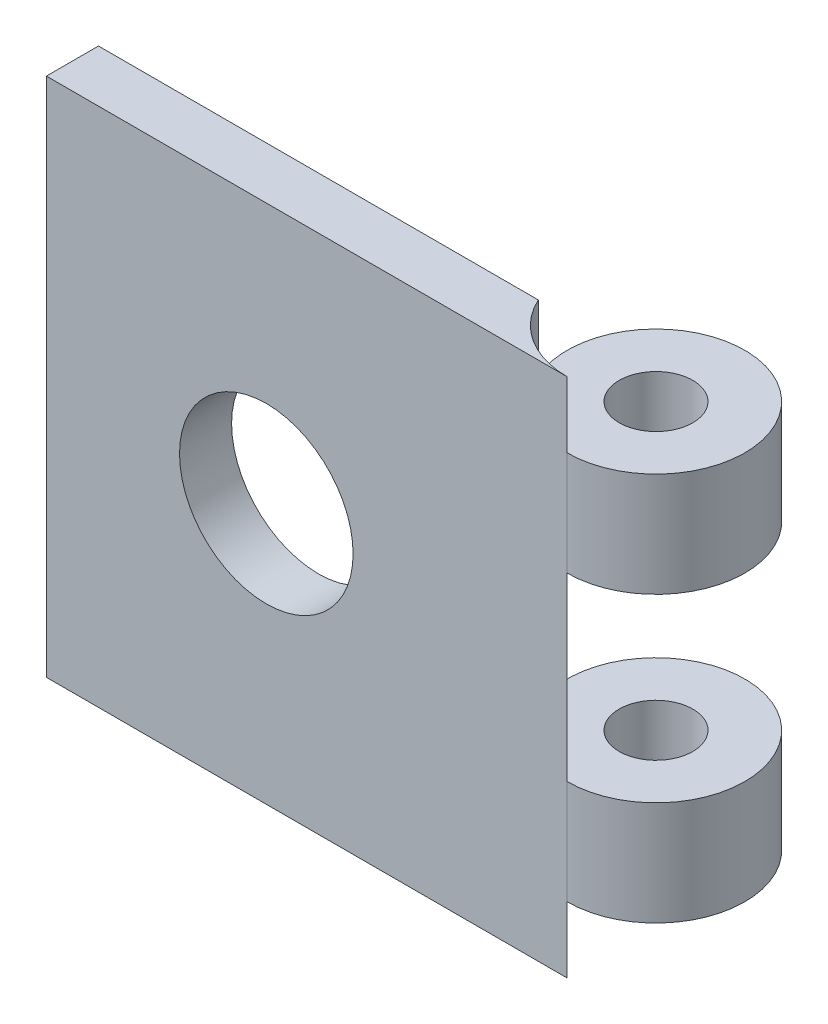
ISO-10303-21;
HEADER;
FILE_DESCRIPTION(('STEP AP214'),'2;1');
FILE_NAME('part.step','',(''),(''),'','','');
FILE_SCHEMA(('AUTOMOTIVE_DESIGN { 1 0 10303 214 1 1 1 1 }'));
ENDSEC;
DATA;
#1=APPLICATION_CONTEXT('core data for automotive mechanical design processes');
#2=APPLICATION_PROTOCOL_DEFINITION('international standard','automotive_design',2000,#1);
#3=PRODUCT_CONTEXT('',#1,'mechanical');
#4=PRODUCT('Part','Part','',(#3));
#5=PRODUCT_RELATED_PRODUCT_CATEGORY('part','',(#4));
#6=PRODUCT_DEFINITION_FORMATION('','',#4);
#7=PRODUCT_DEFINITION_CONTEXT('part definition',#1,'design');
#8=PRODUCT_DEFINITION('design','',#6,#7);
#9=PRODUCT_DEFINITION_SHAPE('','',#8);
#10=(LENGTH_UNIT() NAMED_UNIT(*) SI_UNIT(.MILLI.,.METRE.));
#11=(NAMED_UNIT(*) PLANE_ANGLE_UNIT() SI_UNIT($,.RADIAN.));
#12=(NAMED_UNIT(*) SI_UNIT($,.STERADIAN.) SOLID_ANGLE_UNIT());
#13=UNCERTAINTY_MEASURE_WITH_UNIT(LENGTH_MEASURE(1.E-05),#10,'distance_accuracy_value','');
#14=(GEOMETRIC_REPRESENTATION_CONTEXT(3) GLOBAL_UNCERTAINTY_ASSIGNED_CONTEXT((#13)) GLOBAL_UNIT_ASSIGNED_CONTEXT((#10,
#11,#12)) REPRESENTATION_CONTEXT('',''));
#15=CARTESIAN_POINT('',(0.,0.,0.));
#16=DIRECTION('',(0.,0.,1.));
#17=DIRECTION('',(1.,0.,0.));
#18=AXIS2_PLACEMENT_3D('',#15,#16,#17);
#19=CARTESIAN_POINT('',(15.,-7.5,-2.56));
#20=DIRECTION('',(0.,1.,0.));
#21=DIRECTION('',(0.,0.,1.));
#22=AXIS2_PLACEMENT_3D('',#19,#20,#21);
#23=CYLINDRICAL_SURFACE('',#22,2.56);
#24=CARTESIAN_POINT('',(15.,-5.6,-2.56));
#25=DIRECTION('',(0.,1.,0.));
#26=DIRECTION('',(0.,0.,1.));
#27=AXIS2_PLACEMENT_3D('',#24,#25,#26);
#28=CIRCLE('',#27,2.56);
#29=CARTESIAN_POINT('',(12.6697639604538,-5.6,-1.5));
#30=VERTEX_POINT('',#29);
#31=CARTESIAN_POINT('',(15.,-5.6,0.));
#32=VERTEX_POINT('',#31);
#33=EDGE_CURVE('E57',#30,#32,#28,.T.);
#34=ORIENTED_EDGE('',*,*,#33,.T.);
#35=DIRECTION('',(0.,1.,0.));
#36=VECTOR('',#35,1.);
#37=CARTESIAN_POINT('',(15.,-7.5,0.));
#38=LINE('',#37,#36);
#39=CARTESIAN_POINT('',(15.,-7.5,0.));
#40=VERTEX_POINT('',#39);
#41=EDGE_CURVE('E11',#40,#32,#38,.T.);
#42=ORIENTED_EDGE('',*,*,#41,.F.);
#43=CARTESIAN_POINT('',(15.,-7.5,-2.56));
#44=DIRECTION('',(0.,1.,0.));
#45=DIRECTION('',(0.,0.,1.));
#46=AXIS2_PLACEMENT_3D('',#43,#44,#45);
#47=CIRCLE('',#46,2.56);
#48=CARTESIAN_POINT('',(12.6697639604538,-7.5,-1.5));
#49=VERTEX_POINT('',#48);
#50=EDGE_CURVE('E162',#49,#40,#47,.T.);
#51=ORIENTED_EDGE('',*,*,#50,.F.);
#52=DIRECTION('',(0.,1.,0.));
#53=VECTOR('',#52,1.);
#54=CARTESIAN_POINT('',(12.6697639604538,-7.5,-1.5));
#55=LINE('',#54,#53);
#56=EDGE_CURVE('E36',#49,#30,#55,.T.);
#57=ORIENTED_EDGE('',*,*,#56,.T.);
#58=EDGE_LOOP('',(#34,#42,#51,#57));
#59=FACE_BOUND('',#58,.T.);
#60=ADVANCED_FACE('F32',(#59),#23,.F.);
#61=CARTESIAN_POINT('',(15.,-2.6,0.));
#62=VERTEX_POINT('',#61);
#63=CARTESIAN_POINT('',(15.,2.6,0.));
#64=VERTEX_POINT('',#63);
#65=EDGE_CURVE('E41',#62,#64,#38,.T.);
#66=ORIENTED_EDGE('',*,*,#65,.F.);
#67=CARTESIAN_POINT('',(15.,-2.6,-2.56));
#68=DIRECTION('',(0.,1.,0.));
#69=DIRECTION('',(0.,0.,1.));
#70=AXIS2_PLACEMENT_3D('',#67,#68,#69);
#71=CIRCLE('',#70,2.56);
#72=CARTESIAN_POINT('',(12.6697639604538,-2.6,-1.5));
#73=VERTEX_POINT('',#72);
#74=EDGE_CURVE('E109',#73,#62,#71,.T.);
#75=ORIENTED_EDGE('',*,*,#74,.F.);
#76=CARTESIAN_POINT('',(12.6697639604538,2.6,-1.5));
#77=VERTEX_POINT('',#76);
#78=EDGE_CURVE('E100',#73,#77,#55,.T.);
#79=ORIENTED_EDGE('',*,*,#78,.T.);
#80=CARTESIAN_POINT('',(15.,2.6,-2.56));
#81=DIRECTION('',(0.,1.,0.));
#82=DIRECTION('',(0.,0.,1.));
#83=AXIS2_PLACEMENT_3D('',#80,#81,#82);
#84=CIRCLE('',#83,2.56);
#85=EDGE_CURVE('E145',#77,#64,#84,.T.);
#86=ORIENTED_EDGE('',*,*,#85,.T.);
#87=EDGE_LOOP('',(#66,#75,#79,#86));
#88=FACE_BOUND('',#87,.T.);
#89=ADVANCED_FACE('F110',(#88),#23,.F.);
#90=CARTESIAN_POINT('',(15.,5.6,0.));
#91=VERTEX_POINT('',#90);
#92=CARTESIAN_POINT('',(15.,7.5,0.));
#93=VERTEX_POINT('',#92);
#94=EDGE_CURVE('E43',#91,#93,#38,.T.);
#95=ORIENTED_EDGE('',*,*,#94,.F.);
#96=CARTESIAN_POINT('',(15.,5.6,-2.56));
#97=DIRECTION('',(0.,1.,0.));
#98=DIRECTION('',(0.,0.,1.));
#99=AXIS2_PLACEMENT_3D('',#96,#97,#98);
#100=CIRCLE('',#99,2.56);
#101=CARTESIAN_POINT('',(12.6697639604538,5.6,-1.5));
#102=VERTEX_POINT('',#101);
#103=EDGE_CURVE('E137',#102,#91,#100,.T.);
#104=ORIENTED_EDGE('',*,*,#103,.F.);
#105=CARTESIAN_POINT('',(12.6697639604538,7.5,-1.5));
#106=VERTEX_POINT('',#105);
#107=EDGE_CURVE('E123',#102,#106,#55,.T.);
#108=ORIENTED_EDGE('',*,*,#107,.T.);
#109=CARTESIAN_POINT('',(15.,7.5,-2.56));
#110=DIRECTION('',(0.,1.,0.));
#111=DIRECTION('',(0.,0.,1.));
#112=AXIS2_PLACEMENT_3D('',#109,#110,#111);
#113=CIRCLE('',#112,2.56);
#114=EDGE_CURVE('E150',#106,#93,#113,.T.);
#115=ORIENTED_EDGE('',*,*,#114,.T.);
#116=EDGE_LOOP('',(#95,#104,#108,#115));
#117=FACE_BOUND('',#116,.T.);
#118=ADVANCED_FACE('F34',(#117),#23,.F.);
#119=CARTESIAN_POINT('',(0.,-7.5,0.));
#120=DIRECTION('',(0.,0.,1.));
#121=DIRECTION('',(1.,0.,0.));
#122=AXIS2_PLACEMENT_3D('',#119,#120,#121);
#123=PLANE('',#122);
#124=CARTESIAN_POINT('',(6.33488198022689,0.,0.));
#125=DIRECTION('',(0.,0.,1.));
#126=DIRECTION('',(1.,0.,0.));
#127=AXIS2_PLACEMENT_3D('',#124,#125,#126);
#128=CIRCLE('',#127,2.5);
#129=CARTESIAN_POINT('',(8.83488198022689,0.,0.));
#130=VERTEX_POINT('',#129);
#131=EDGE_CURVE('E238',#130,#130,#128,.T.);
#132=ORIENTED_EDGE('',*,*,#131,.F.);
#133=EDGE_LOOP('',(#132));
#134=FACE_BOUND('',#133,.T.);
#135=ORIENTED_EDGE('',*,*,#41,.T.);
#136=DIRECTION('',(0.,1.,0.));
#137=VECTOR('',#136,1.);
#138=CARTESIAN_POINT('',(15.,-5.6,0.));
#139=LINE('',#138,#137);
#140=EDGE_CURVE('E131',#32,#62,#139,.T.);
#141=ORIENTED_EDGE('',*,*,#140,.T.);
#142=ORIENTED_EDGE('',*,*,#65,.T.);
#143=DIRECTION('',(0.,-1.,0.));
#144=VECTOR('',#143,1.);
#145=CARTESIAN_POINT('',(15.,5.6,0.));
#146=LINE('',#145,#144);
#147=EDGE_CURVE('E142',#64,#91,#146,.F.);
#148=ORIENTED_EDGE('',*,*,#147,.T.);
#149=ORIENTED_EDGE('',*,*,#94,.T.);
#150=DIRECTION('',(1.,0.,0.));
#151=VECTOR('',#150,1.);
#152=CARTESIAN_POINT('',(0.,7.5,0.));
#153=LINE('',#152,#151);
#154=CARTESIAN_POINT('',(0.,7.5,0.));
#155=VERTEX_POINT('',#154);
#156=EDGE_CURVE('E159',#155,#93,#153,.T.);
#157=ORIENTED_EDGE('',*,*,#156,.F.);
#158=DIRECTION('',(0.,1.,0.));
#159=VECTOR('',#158,1.);
#160=CARTESIAN_POINT('',(0.,-7.5,0.));
#161=LINE('',#160,#159);
#162=CARTESIAN_POINT('',(0.,-7.5,0.));
#163=VERTEX_POINT('',#162);
#164=EDGE_CURVE('E171',#163,#155,#161,.T.);
#165=ORIENTED_EDGE('',*,*,#164,.F.);
#166=DIRECTION('',(1.,0.,0.));
#167=VECTOR('',#166,1.);
#168=CARTESIAN_POINT('',(0.,-7.5,0.));
#169=LINE('',#168,#167);
#170=EDGE_CURVE('E168',#163,#40,#169,.T.);
#171=ORIENTED_EDGE('',*,*,#170,.T.);
#172=EDGE_LOOP('',(#135,#141,#142,#148,#149,#157,#165,#171));
#173=FACE_BOUND('',#172,.T.);
#174=ADVANCED_FACE('F188',(#134,#173),#123,.T.);
#175=CARTESIAN_POINT('',(0.,-7.5,0.));
#176=DIRECTION('',(1.,0.,0.));
#177=DIRECTION('',(0.,0.,-1.));
#178=AXIS2_PLACEMENT_3D('',#175,#176,#177);
#179=PLANE('',#178);
#180=ORIENTED_EDGE('',*,*,#164,.T.);
#181=DIRECTION('',(0.,0.,-1.));
#182=VECTOR('',#181,1.);
#183=CARTESIAN_POINT('',(0.,7.5,0.));
#184=LINE('',#183,#182);
#185=CARTESIAN_POINT('',(0.,7.5,-1.5));
#186=VERTEX_POINT('',#185);
#187=EDGE_CURVE('E156',#155,#186,#184,.T.);
#188=ORIENTED_EDGE('',*,*,#187,.T.);
#189=DIRECTION('',(0.,1.,0.));
#190=VECTOR('',#189,1.);
#191=CARTESIAN_POINT('',(0.,-7.5,-1.5));
#192=LINE('',#191,#190);
#193=CARTESIAN_POINT('',(0.,-7.5,-1.5));
#194=VERTEX_POINT('',#193);
#195=EDGE_CURVE('E172',#194,#186,#192,.T.);
#196=ORIENTED_EDGE('',*,*,#195,.F.);
#197=DIRECTION('',(0.,0.,-1.));
#198=VECTOR('',#197,1.);
#199=CARTESIAN_POINT('',(0.,-7.5,0.));
#200=LINE('',#199,#198);
#201=EDGE_CURVE('E166',#163,#194,#200,.T.);
#202=ORIENTED_EDGE('',*,*,#201,.F.);
#203=EDGE_LOOP('',(#180,#188,#196,#202));
#204=FACE_BOUND('',#203,.T.);
#205=ADVANCED_FACE('F216',(#204),#179,.F.);
#206=CARTESIAN_POINT('',(0.,-7.5,-1.5));
#207=DIRECTION('',(0.,0.,1.));
#208=DIRECTION('',(1.,0.,0.));
#209=AXIS2_PLACEMENT_3D('',#206,#207,#208);
#210=PLANE('',#209);
#211=CARTESIAN_POINT('',(6.33488198022689,0.,-1.5));
#212=DIRECTION('',(0.,0.,-1.));
#213=DIRECTION('',(-1.,0.,0.));
#214=AXIS2_PLACEMENT_3D('',#211,#212,#213);
#215=CIRCLE('',#214,2.5);
#216=CARTESIAN_POINT('',(3.83488198022689,0.,-1.5));
#217=VERTEX_POINT('',#216);
#218=EDGE_CURVE('E236',#217,#217,#215,.T.);
#219=ORIENTED_EDGE('',*,*,#218,.F.);
#220=EDGE_LOOP('',(#219));
#221=FACE_BOUND('',#220,.T.);
#222=ORIENTED_EDGE('',*,*,#195,.T.);
#223=DIRECTION('',(1.,0.,0.));
#224=VECTOR('',#223,1.);
#225=CARTESIAN_POINT('',(0.,7.5,-1.5));
#226=LINE('',#225,#224);
#227=EDGE_CURVE('E153',#186,#106,#226,.T.);
#228=ORIENTED_EDGE('',*,*,#227,.T.);
#229=ORIENTED_EDGE('',*,*,#107,.F.);
#230=EDGE_CURVE('E106',#77,#102,#55,.T.);
#231=ORIENTED_EDGE('',*,*,#230,.F.);
#232=ORIENTED_EDGE('',*,*,#78,.F.);
#233=EDGE_CURVE('E104',#30,#73,#55,.T.);
#234=ORIENTED_EDGE('',*,*,#233,.F.);
#235=ORIENTED_EDGE('',*,*,#56,.F.);
#236=DIRECTION('',(1.,0.,0.));
#237=VECTOR('',#236,1.);
#238=CARTESIAN_POINT('',(0.,-7.5,-1.5));
#239=LINE('',#238,#237);
#240=EDGE_CURVE('E164',#194,#49,#239,.T.);
#241=ORIENTED_EDGE('',*,*,#240,.F.);
#242=EDGE_LOOP('',(#222,#228,#229,#231,#232,#234,#235,#241));
#243=FACE_BOUND('',#242,.T.);
#244=ADVANCED_FACE('F101',(#221,#243),#210,.F.);
#245=CARTESIAN_POINT('',(0.,-7.5,0.));
#246=DIRECTION('',(0.,1.,0.));
#247=DIRECTION('',(0.,0.,1.));
#248=AXIS2_PLACEMENT_3D('',#245,#246,#247);
#249=PLANE('',#248);
#250=ORIENTED_EDGE('',*,*,#50,.T.);
#251=ORIENTED_EDGE('',*,*,#170,.F.);
#252=ORIENTED_EDGE('',*,*,#201,.T.);
#253=ORIENTED_EDGE('',*,*,#240,.T.);
#254=EDGE_LOOP('',(#250,#251,#252,#253));
#255=FACE_BOUND('',#254,.T.);
#256=ADVANCED_FACE('F226',(#255),#249,.F.);
#257=CARTESIAN_POINT('',(0.,7.5,0.));
#258=DIRECTION('',(0.,1.,0.));
#259=DIRECTION('',(0.,0.,1.));
#260=AXIS2_PLACEMENT_3D('',#257,#258,#259);
#261=PLANE('',#260);
#262=ORIENTED_EDGE('',*,*,#114,.F.);
#263=ORIENTED_EDGE('',*,*,#227,.F.);
#264=ORIENTED_EDGE('',*,*,#187,.F.);
#265=ORIENTED_EDGE('',*,*,#156,.T.);
#266=EDGE_LOOP('',(#262,#263,#264,#265));
#267=FACE_BOUND('',#266,.T.);
#268=ADVANCED_FACE('F184',(#267),#261,.T.);
#269=CARTESIAN_POINT('',(15.,5.6,-2.56));
#270=DIRECTION('',(0.,-1.,0.));
#271=DIRECTION('',(0.,0.,-1.));
#272=AXIS2_PLACEMENT_3D('',#269,#270,#271);
#273=CYLINDRICAL_SURFACE('',#272,1.06);
#274=CARTESIAN_POINT('',(15.,5.6,-2.56));
#275=DIRECTION('',(0.,1.,0.));
#276=DIRECTION('',(0.,0.,1.));
#277=AXIS2_PLACEMENT_3D('',#274,#275,#276);
#278=CIRCLE('',#277,1.06);
#279=CARTESIAN_POINT('',(15.,5.6,-1.5));
#280=VERTEX_POINT('',#279);
#281=EDGE_CURVE('E134',#280,#280,#278,.T.);
#282=ORIENTED_EDGE('',*,*,#281,.T.);
#283=EDGE_LOOP('',(#282));
#284=FACE_BOUND('',#283,.T.);
#285=CARTESIAN_POINT('',(15.,2.6,-2.56));
#286=DIRECTION('',(0.,1.,0.));
#287=DIRECTION('',(0.,0.,1.));
#288=AXIS2_PLACEMENT_3D('',#285,#286,#287);
#289=CIRCLE('',#288,1.06);
#290=CARTESIAN_POINT('',(15.,2.6,-1.5));
#291=VERTEX_POINT('',#290);
#292=EDGE_CURVE('E133',#291,#291,#289,.T.);
#293=ORIENTED_EDGE('',*,*,#292,.F.);
#294=EDGE_LOOP('',(#293));
#295=FACE_BOUND('',#294,.T.);
#296=ADVANCED_FACE('F309',(#284,#295),#273,.F.);
#297=CARTESIAN_POINT('',(15.,5.6,-2.56));
#298=DIRECTION('',(0.,-1.,0.));
#299=DIRECTION('',(0.,0.,-1.));
#300=AXIS2_PLACEMENT_3D('',#297,#298,#299);
#301=CYLINDRICAL_SURFACE('',#300,2.56);
#302=ORIENTED_EDGE('',*,*,#147,.F.);
#303=EDGE_CURVE('E138',#64,#77,#84,.T.);
#304=ORIENTED_EDGE('',*,*,#303,.T.);
#305=ORIENTED_EDGE('',*,*,#230,.T.);
#306=EDGE_CURVE('E139',#91,#102,#100,.T.);
#307=ORIENTED_EDGE('',*,*,#306,.F.);
#308=EDGE_LOOP('',(#302,#304,#305,#307));
#309=FACE_BOUND('',#308,.T.);
#310=ADVANCED_FACE('F193',(#309),#301,.T.);
#311=CARTESIAN_POINT('',(0.,5.6,0.));
#312=DIRECTION('',(0.,1.,0.));
#313=DIRECTION('',(0.,0.,1.));
#314=AXIS2_PLACEMENT_3D('',#311,#312,#313);
#315=PLANE('',#314);
#316=ORIENTED_EDGE('',*,*,#281,.F.);
#317=EDGE_LOOP('',(#316));
#318=FACE_BOUND('',#317,.T.);
#319=ORIENTED_EDGE('',*,*,#306,.T.);
#320=ORIENTED_EDGE('',*,*,#103,.T.);
#321=EDGE_LOOP('',(#319,#320));
#322=FACE_BOUND('',#321,.T.);
#323=ADVANCED_FACE('F196',(#318,#322),#315,.T.);
#324=CARTESIAN_POINT('',(0.,2.6,0.));
#325=DIRECTION('',(0.,1.,0.));
#326=DIRECTION('',(0.,0.,1.));
#327=AXIS2_PLACEMENT_3D('',#324,#325,#326);
#328=PLANE('',#327);
#329=ORIENTED_EDGE('',*,*,#292,.T.);
#330=EDGE_LOOP('',(#329));
#331=FACE_BOUND('',#330,.T.);
#332=ORIENTED_EDGE('',*,*,#303,.F.);
#333=ORIENTED_EDGE('',*,*,#85,.F.);
#334=EDGE_LOOP('',(#332,#333));
#335=FACE_BOUND('',#334,.T.);
#336=ADVANCED_FACE('F194',(#331,#335),#328,.F.);
#337=CARTESIAN_POINT('',(15.,-5.6,-2.56));
#338=DIRECTION('',(0.,1.,0.));
#339=DIRECTION('',(0.,0.,1.));
#340=AXIS2_PLACEMENT_3D('',#337,#338,#339);
#341=CYLINDRICAL_SURFACE('',#340,2.56);
#342=ORIENTED_EDGE('',*,*,#140,.F.);
#343=EDGE_CURVE('E122',#32,#30,#28,.T.);
#344=ORIENTED_EDGE('',*,*,#343,.T.);
#345=ORIENTED_EDGE('',*,*,#233,.T.);
#346=EDGE_CURVE('E114',#62,#73,#71,.T.);
#347=ORIENTED_EDGE('',*,*,#346,.F.);
#348=EDGE_LOOP('',(#342,#344,#345,#347));
#349=FACE_BOUND('',#348,.T.);
#350=ADVANCED_FACE('F120',(#349),#341,.T.);
#351=CARTESIAN_POINT('',(15.,-5.6,-2.56));
#352=DIRECTION('',(0.,1.,0.));
#353=DIRECTION('',(0.,0.,1.));
#354=AXIS2_PLACEMENT_3D('',#351,#352,#353);
#355=CYLINDRICAL_SURFACE('',#354,1.06);
#356=CARTESIAN_POINT('',(15.,-5.6,-2.56));
#357=DIRECTION('',(0.,1.,0.));
#358=DIRECTION('',(0.,0.,1.));
#359=AXIS2_PLACEMENT_3D('',#356,#357,#358);
#360=CIRCLE('',#359,1.06);
#361=CARTESIAN_POINT('',(15.,-5.6,-1.5));
#362=VERTEX_POINT('',#361);
#363=EDGE_CURVE('E125',#362,#362,#360,.T.);
#364=ORIENTED_EDGE('',*,*,#363,.F.);
#365=EDGE_LOOP('',(#364));
#366=FACE_BOUND('',#365,.T.);
#367=CARTESIAN_POINT('',(15.,-2.6,-2.56));
#368=DIRECTION('',(0.,1.,0.));
#369=DIRECTION('',(0.,0.,1.));
#370=AXIS2_PLACEMENT_3D('',#367,#368,#369);
#371=CIRCLE('',#370,1.06);
#372=CARTESIAN_POINT('',(15.,-2.6,-1.5));
#373=VERTEX_POINT('',#372);
#374=EDGE_CURVE('E115',#373,#373,#371,.T.);
#375=ORIENTED_EDGE('',*,*,#374,.T.);
#376=EDGE_LOOP('',(#375));
#377=FACE_BOUND('',#376,.T.);
#378=ADVANCED_FACE('F203',(#366,#377),#355,.F.);
#379=CARTESIAN_POINT('',(0.,-5.6,0.));
#380=DIRECTION('',(0.,1.,0.));
#381=DIRECTION('',(0.,0.,1.));
#382=AXIS2_PLACEMENT_3D('',#379,#380,#381);
#383=PLANE('',#382);
#384=ORIENTED_EDGE('',*,*,#363,.T.);
#385=EDGE_LOOP('',(#384));
#386=FACE_BOUND('',#385,.T.);
#387=ORIENTED_EDGE('',*,*,#343,.F.);
#388=ORIENTED_EDGE('',*,*,#33,.F.);
#389=EDGE_LOOP('',(#387,#388));
#390=FACE_BOUND('',#389,.T.);
#391=ADVANCED_FACE('F249',(#386,#390),#383,.F.);
#392=CARTESIAN_POINT('',(0.,-2.6,0.));
#393=DIRECTION('',(0.,1.,0.));
#394=DIRECTION('',(0.,0.,1.));
#395=AXIS2_PLACEMENT_3D('',#392,#393,#394);
#396=PLANE('',#395);
#397=ORIENTED_EDGE('',*,*,#374,.F.);
#398=EDGE_LOOP('',(#397));
#399=FACE_BOUND('',#398,.T.);
#400=ORIENTED_EDGE('',*,*,#346,.T.);
#401=ORIENTED_EDGE('',*,*,#74,.T.);
#402=EDGE_LOOP('',(#400,#401));
#403=FACE_BOUND('',#402,.T.);
#404=ADVANCED_FACE('F124',(#399,#403),#396,.T.);
#405=CARTESIAN_POINT('',(6.33488198022689,0.,1.5));
#406=DIRECTION('',(0.,0.,-1.));
#407=DIRECTION('',(-1.,0.,0.));
#408=AXIS2_PLACEMENT_3D('',#405,#406,#407);
#409=CYLINDRICAL_SURFACE('',#408,2.5);
#410=ORIENTED_EDGE('',*,*,#131,.T.);
#411=EDGE_LOOP('',(#410));
#412=FACE_BOUND('',#411,.T.);
#413=ORIENTED_EDGE('',*,*,#218,.T.);
#414=EDGE_LOOP('',(#413));
#415=FACE_BOUND('',#414,.T.);
#416=ADVANCED_FACE('F248',(#412,#415),#409,.F.);
#417=CLOSED_SHELL('',(#60,#89,#118,#174,#205,#244,#256,#268,#296,#310,#323,#336,#350,#378,#391,
#404,#416));
#418=MANIFOLD_SOLID_BREP('B2',#417);
#419=ADVANCED_BREP_SHAPE_REPRESENTATION('',(#18,#418),#14);
#420=SHAPE_DEFINITION_REPRESENTATION(#9,#419);
ENDSEC;
END-ISO-10303-21;
